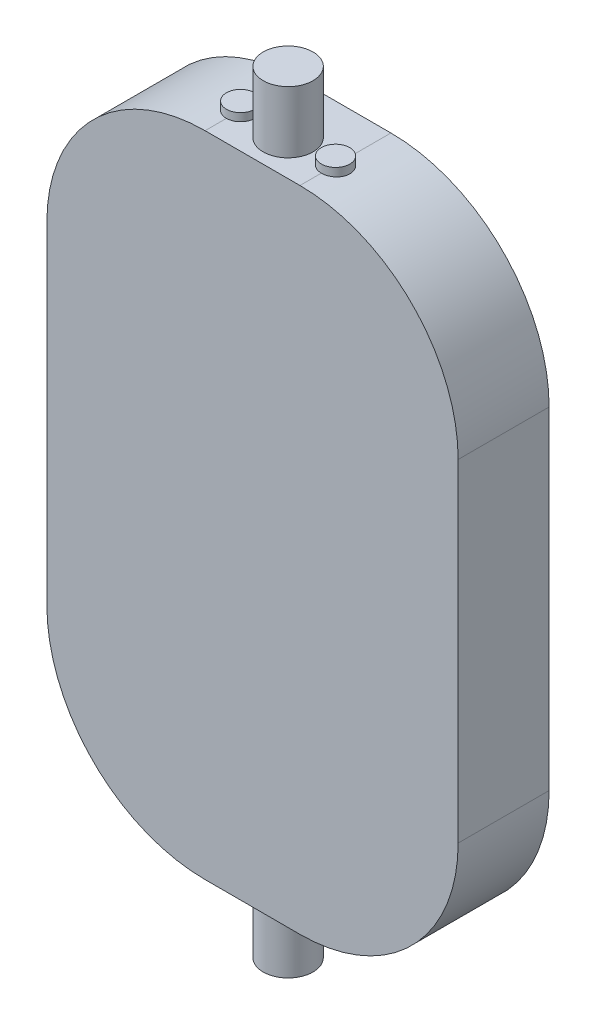
ISO-10303-21;
HEADER;
FILE_DESCRIPTION(('STEP AP214'),'2;1');
FILE_NAME('part.step','',(''),(''),'','','');
FILE_SCHEMA(('AUTOMOTIVE_DESIGN { 1 0 10303 214 1 1 1 1 }'));
ENDSEC;
DATA;
#1=APPLICATION_CONTEXT('core data for automotive mechanical design processes');
#2=APPLICATION_PROTOCOL_DEFINITION('international standard','automotive_design',2000,#1);
#3=PRODUCT_CONTEXT('',#1,'mechanical');
#4=PRODUCT('Part','Part','',(#3));
#5=PRODUCT_RELATED_PRODUCT_CATEGORY('part','',(#4));
#6=PRODUCT_DEFINITION_FORMATION('','',#4);
#7=PRODUCT_DEFINITION_CONTEXT('part definition',#1,'design');
#8=PRODUCT_DEFINITION('design','',#6,#7);
#9=PRODUCT_DEFINITION_SHAPE('','',#8);
#10=(LENGTH_UNIT() NAMED_UNIT(*) SI_UNIT(.MILLI.,.METRE.));
#11=(NAMED_UNIT(*) PLANE_ANGLE_UNIT() SI_UNIT($,.RADIAN.));
#12=(NAMED_UNIT(*) SI_UNIT($,.STERADIAN.) SOLID_ANGLE_UNIT());
#13=UNCERTAINTY_MEASURE_WITH_UNIT(LENGTH_MEASURE(1.E-05),#10,'distance_accuracy_value','');
#14=(GEOMETRIC_REPRESENTATION_CONTEXT(3) GLOBAL_UNCERTAINTY_ASSIGNED_CONTEXT((#13)) GLOBAL_UNIT_ASSIGNED_CONTEXT((#10,
#11,#12)) REPRESENTATION_CONTEXT('',''));
#15=CARTESIAN_POINT('',(0.,0.,0.));
#16=DIRECTION('',(0.,0.,1.));
#17=DIRECTION('',(1.,0.,0.));
#18=AXIS2_PLACEMENT_3D('',#15,#16,#17);
#19=CARTESIAN_POINT('',(5.99999999999997,-21.,11.5));
#20=DIRECTION('',(0.,0.,-1.));
#21=DIRECTION('',(-1.,0.,0.));
#22=AXIS2_PLACEMENT_3D('',#19,#20,#21);
#23=CYLINDRICAL_SURFACE('',#22,20.);
#24=CARTESIAN_POINT('',(5.99999999999999,-41.,5.2));
#25=CARTESIAN_POINT('',(6.05053264670488,-41.0000010702056,5.20000021519562));
#26=CARTESIAN_POINT('',(6.10104098540096,-40.9998082409723,5.20212929468351));
#27=CARTESIAN_POINT('',(6.20169426691106,-40.9990461347195,5.21062226581715));
#28=CARTESIAN_POINT('',(6.25183923230774,-40.9984768813001,5.21698589197571));
#29=CARTESIAN_POINT('',(6.40109112312599,-40.9962241188083,5.24236480383873));
#30=CARTESIAN_POINT('',(6.499195131727,-40.9939955291772,5.26766831019062));
#31=CARTESIAN_POINT('',(6.68973751877992,-40.9883310561541,5.33432651535487));
#32=CARTESIAN_POINT('',(6.78217364739323,-40.9848946969409,5.3756875409719));
#33=CARTESIAN_POINT('',(6.95879318055657,-40.977200275102,5.47327540660538));
#34=CARTESIAN_POINT('',(7.04297770109758,-40.9729423238245,5.52950023254986));
#35=CARTESIAN_POINT('',(7.20093776793326,-40.9640686244097,5.6553899217196));
#36=CARTESIAN_POINT('',(7.27468649274738,-40.9594519999173,5.72508836511051));
#37=CARTESIAN_POINT('',(7.40946530727147,-40.9503880037537,5.87588493339273));
#38=CARTESIAN_POINT('',(7.47049345458673,-40.9459406580154,5.95698479608595));
#39=CARTESIAN_POINT('',(7.57818155666296,-40.9377098860698,6.12844457208369));
#40=CARTESIAN_POINT('',(7.62481714068026,-40.9339275905915,6.21881985033743));
#41=CARTESIAN_POINT('',(7.70223843318381,-40.9274660281103,6.40615243773806));
#42=CARTESIAN_POINT('',(7.73302542357588,-40.9247866719001,6.50310921382544));
#43=CARTESIAN_POINT('',(7.77779892648844,-40.9208418506557,6.70057900148442));
#44=CARTESIAN_POINT('',(7.79183073178024,-40.9195725745304,6.80108166615477));
#45=CARTESIAN_POINT('',(7.80283559654912,-40.9185796668399,7.00302553669953));
#46=CARTESIAN_POINT('',(7.79980860654651,-40.9188560397579,7.10446674529536));
#47=CARTESIAN_POINT('',(7.77681859377172,-40.9209197865548,7.30509149942634));
#48=CARTESIAN_POINT('',(7.75690537821566,-40.9227027166731,7.40428080460715));
#49=CARTESIAN_POINT('',(7.70078567584156,-40.9275717188637,7.59790309802585));
#50=CARTESIAN_POINT('',(7.66457908586072,-40.9306577991869,7.69233605614435));
#51=CARTESIAN_POINT('',(7.57684415523089,-40.9377905697663,7.87392554241418));
#52=CARTESIAN_POINT('',(7.52529325268648,-40.9418386727773,7.96107111197888));
#53=CARTESIAN_POINT('',(7.40835159535946,-40.9504378719519,8.12548775504));
#54=CARTESIAN_POINT('',(7.34296114146228,-40.9549889571792,8.20275904315441));
#55=CARTESIAN_POINT('',(7.19992823344365,-40.9641006317731,8.3455175807064));
#56=CARTESIAN_POINT('',(7.12224445879866,-40.9686612000752,8.41096343349004));
#57=CARTESIAN_POINT('',(6.95694078829779,-40.9772646084449,8.52791198193278));
#58=CARTESIAN_POINT('',(6.8693178591201,-40.9813072896531,8.57941040465589));
#59=CARTESIAN_POINT('',(6.686584226363,-40.9884208643474,8.66699818281534));
#60=CARTESIAN_POINT('',(6.59146813372821,-40.9914910503023,8.70307632598674));
#61=CARTESIAN_POINT('',(6.39656612188761,-40.9963044433189,8.75868455376905));
#62=CARTESIAN_POINT('',(6.296787519764,-40.9980496600799,8.77823970538766));
#63=CARTESIAN_POINT('',(6.16359762932726,-40.9993578315683,8.79285195150572));
#64=CARTESIAN_POINT('',(6.13090711377621,-40.9995985025723,8.7955338185538));
#65=CARTESIAN_POINT('',(6.06548225078416,-40.9999193849882,8.79910541667386));
#66=CARTESIAN_POINT('',(6.03274806771157,-40.9999998636948,8.79999813311675));
#67=CARTESIAN_POINT('',(5.99999999999999,-41.,8.8));
#68=B_SPLINE_CURVE_WITH_KNOTS('',3,(#24,#25,#26,#27,#28,#29,#30,#31,#32,#33,#34,#35,#36,#37,#38,
#39,#40,#41,#42,#43,#44,#45,#46,#47,#48,#49,#50,#51,#52,#53,#54,#55,#56,#57,#58,#59,#60,#61,#62,
#63,#64,#65,#66,#67),.UNSPECIFIED.,.F.,.F.,(4,2,2,2,2,2,2,2,2,2,2,2,2,2,2,2,2,2,2,2,2,4),(0.,
0.151504508919029,0.302999520075793,0.605456174712382,0.908032121090338,1.2105670888737,
1.51386601585822,1.81721122182237,2.12106729525657,2.42489878757611,2.72790708690254,
3.03091626511682,3.33303479087839,3.63515522955455,3.93772211170358,4.24028241642742,
4.54388218138447,4.84757485225174,5.15148796748767,5.45493918445417,5.55330764444217,
5.65151183002399),.UNSPECIFIED.);
#69=CARTESIAN_POINT('',(5.99999999999998,-41.,5.2));
#70=VERTEX_POINT('',#69);
#71=CARTESIAN_POINT('',(5.99999999999999,-41.,8.8));
#72=VERTEX_POINT('',#71);
#73=EDGE_CURVE('E11',#70,#72,#68,.T.);
#74=ORIENTED_EDGE('',*,*,#73,.F.);
#75=DIRECTION('',(0.,0.,-1.));
#76=VECTOR('',#75,1.);
#77=CARTESIAN_POINT('',(5.99999999999998,-41.,11.5));
#78=LINE('',#77,#76);
#79=CARTESIAN_POINT('',(5.99999999999998,-41.,0.));
#80=VERTEX_POINT('',#79);
#81=EDGE_CURVE('E139',#70,#80,#78,.T.);
#82=ORIENTED_EDGE('',*,*,#81,.T.);
#83=CARTESIAN_POINT('',(5.99999999999997,-21.,0.));
#84=DIRECTION('',(0.,0.,1.));
#85=DIRECTION('',(1.,0.,0.));
#86=AXIS2_PLACEMENT_3D('',#83,#84,#85);
#87=CIRCLE('',#86,20.);
#88=CARTESIAN_POINT('',(26.,-21.,0.));
#89=VERTEX_POINT('',#88);
#90=EDGE_CURVE('E312',#80,#89,#87,.T.);
#91=ORIENTED_EDGE('',*,*,#90,.T.);
#92=DIRECTION('',(0.,0.,-1.));
#93=VECTOR('',#92,1.);
#94=CARTESIAN_POINT('',(26.,-21.,11.5));
#95=LINE('',#94,#93);
#96=CARTESIAN_POINT('',(26.,-21.,11.5));
#97=VERTEX_POINT('',#96);
#98=EDGE_CURVE('E338',#97,#89,#95,.T.);
#99=ORIENTED_EDGE('',*,*,#98,.F.);
#100=CARTESIAN_POINT('',(5.99999999999997,-21.,11.5));
#101=DIRECTION('',(0.,0.,1.));
#102=DIRECTION('',(1.,0.,0.));
#103=AXIS2_PLACEMENT_3D('',#100,#101,#102);
#104=CIRCLE('',#103,20.);
#105=CARTESIAN_POINT('',(5.99999999999998,-41.,11.5));
#106=VERTEX_POINT('',#105);
#107=EDGE_CURVE('E135',#106,#97,#104,.T.);
#108=ORIENTED_EDGE('',*,*,#107,.F.);
#109=EDGE_CURVE('E132',#106,#72,#78,.T.);
#110=ORIENTED_EDGE('',*,*,#109,.T.);
#111=EDGE_LOOP('',(#74,#82,#91,#99,#108,#110));
#112=FACE_BOUND('',#111,.T.);
#113=ADVANCED_FACE('F39',(#112),#23,.T.);
#114=CARTESIAN_POINT('',(-6.,-21.,11.5));
#115=DIRECTION('',(0.,0.,-1.));
#116=DIRECTION('',(-1.,0.,0.));
#117=AXIS2_PLACEMENT_3D('',#114,#115,#116);
#118=CYLINDRICAL_SURFACE('',#117,20.);
#119=CARTESIAN_POINT('',(-6.,-41.,8.8));
#120=CARTESIAN_POINT('',(-6.05053264670489,-41.0000010702056,8.79999978480438));
#121=CARTESIAN_POINT('',(-6.10104098540097,-40.9998082409723,8.79787070531649));
#122=CARTESIAN_POINT('',(-6.20169426691107,-40.9990461347195,8.78937773418285));
#123=CARTESIAN_POINT('',(-6.25183923230775,-40.9984768813001,8.78301410802429));
#124=CARTESIAN_POINT('',(-6.401091123126,-40.9962241188083,8.75763519616126));
#125=CARTESIAN_POINT('',(-6.499195131727,-40.9939955291772,8.73233168980938));
#126=CARTESIAN_POINT('',(-6.68973751877993,-40.9883310561541,8.66567348464513));
#127=CARTESIAN_POINT('',(-6.78217364739324,-40.9848946969409,8.62431245902809));
#128=CARTESIAN_POINT('',(-6.95879318055658,-40.977200275102,8.52672459339461));
#129=CARTESIAN_POINT('',(-7.04297770109759,-40.9729423238245,8.47049976745013));
#130=CARTESIAN_POINT('',(-7.20093776793327,-40.9640686244097,8.34461007828039));
#131=CARTESIAN_POINT('',(-7.27468649274738,-40.9594519999173,8.27491163488949));
#132=CARTESIAN_POINT('',(-7.40946530727147,-40.9503880037537,8.12411506660726));
#133=CARTESIAN_POINT('',(-7.47049345458673,-40.9459406580154,8.04301520391404));
#134=CARTESIAN_POINT('',(-7.57818155666296,-40.9377098860698,7.87155542791631));
#135=CARTESIAN_POINT('',(-7.62481714068027,-40.9339275905915,7.78118014966256));
#136=CARTESIAN_POINT('',(-7.70223843318382,-40.9274660281103,7.59384756226193));
#137=CARTESIAN_POINT('',(-7.73302542357588,-40.9247866719001,7.49689078617455));
#138=CARTESIAN_POINT('',(-7.77779892648845,-40.9208418506557,7.29942099851557));
#139=CARTESIAN_POINT('',(-7.79183073178024,-40.9195725745304,7.19891833384522));
#140=CARTESIAN_POINT('',(-7.80283559654912,-40.9185796668399,6.99697446330046));
#141=CARTESIAN_POINT('',(-7.79980860654651,-40.9188560397579,6.89553325470463));
#142=CARTESIAN_POINT('',(-7.77681859377172,-40.9209197865548,6.69490850057364));
#143=CARTESIAN_POINT('',(-7.75690537821566,-40.9227027166731,6.59571919539284));
#144=CARTESIAN_POINT('',(-7.70078567584156,-40.9275717188637,6.40209690197414));
#145=CARTESIAN_POINT('',(-7.66457908586072,-40.9306577991869,6.30766394385564));
#146=CARTESIAN_POINT('',(-7.57684415523088,-40.9377905697663,6.12607445758581));
#147=CARTESIAN_POINT('',(-7.52529325268647,-40.9418386727773,6.0389288880211));
#148=CARTESIAN_POINT('',(-7.40835159535946,-40.9504378719519,5.87451224495999));
#149=CARTESIAN_POINT('',(-7.34296114146228,-40.9549889571792,5.79724095684558));
#150=CARTESIAN_POINT('',(-7.19992823344364,-40.9641006317731,5.65448241929359));
#151=CARTESIAN_POINT('',(-7.12224445879865,-40.9686612000752,5.58903656650995));
#152=CARTESIAN_POINT('',(-6.95694078829778,-40.9772646084449,5.47208801806721));
#153=CARTESIAN_POINT('',(-6.86931785912009,-40.9813072896531,5.4205895953441));
#154=CARTESIAN_POINT('',(-6.68658422636299,-40.9884208643474,5.33300181718465));
#155=CARTESIAN_POINT('',(-6.5914681337282,-40.9914910503023,5.29692367401325));
#156=CARTESIAN_POINT('',(-6.3965661218876,-40.9963044433189,5.24131544623094));
#157=CARTESIAN_POINT('',(-6.29678751976399,-40.9980496600799,5.22176029461234));
#158=CARTESIAN_POINT('',(-6.16359762932726,-40.9993578315683,5.20714804849428));
#159=CARTESIAN_POINT('',(-6.1309071137762,-40.9995985025724,5.2044661814462));
#160=CARTESIAN_POINT('',(-6.06548225078416,-40.9999193849882,5.20089458332614));
#161=CARTESIAN_POINT('',(-6.03274806771157,-40.9999998636948,5.20000186688325));
#162=CARTESIAN_POINT('',(-6.,-41.,5.2));
#163=B_SPLINE_CURVE_WITH_KNOTS('',3,(#119,#120,#121,#122,#123,#124,#125,#126,#127,#128,#129,
#130,#131,#132,#133,#134,#135,#136,#137,#138,#139,#140,#141,#142,#143,#144,#145,#146,#147,#148,
#149,#150,#151,#152,#153,#154,#155,#156,#157,#158,#159,#160,#161,#162),.UNSPECIFIED.,.F.,.F.,(4,
2,2,2,2,2,2,2,2,2,2,2,2,2,2,2,2,2,2,2,2,4),(0.,0.151504508919028,0.302999520075792,
0.605456174712382,0.908032121090338,1.2105670888737,1.51386601585822,1.81721122182237,
2.12106729525657,2.42489878757611,2.72790708690254,3.03091626511682,3.33303479087839,
3.63515522955455,3.93772211170358,4.24028241642742,4.54388218138447,4.84757485225174,
5.15148796748767,5.45493918445417,5.55330764444216,5.65151183002397),.UNSPECIFIED.);
#164=CARTESIAN_POINT('',(-6.,-41.,8.8));
#165=VERTEX_POINT('',#164);
#166=CARTESIAN_POINT('',(-6.,-41.,5.2));
#167=VERTEX_POINT('',#166);
#168=EDGE_CURVE('E183',#165,#167,#163,.T.);
#169=ORIENTED_EDGE('',*,*,#168,.F.);
#170=DIRECTION('',(0.,0.,-1.));
#171=VECTOR('',#170,1.);
#172=CARTESIAN_POINT('',(-6.,-41.,11.5));
#173=LINE('',#172,#171);
#174=CARTESIAN_POINT('',(-6.,-41.,11.5));
#175=VERTEX_POINT('',#174);
#176=EDGE_CURVE('E342',#175,#165,#173,.T.);
#177=ORIENTED_EDGE('',*,*,#176,.F.);
#178=CARTESIAN_POINT('',(-6.,-21.,11.5));
#179=DIRECTION('',(0.,0.,1.));
#180=DIRECTION('',(-1.,0.,0.));
#181=AXIS2_PLACEMENT_3D('',#178,#179,#180);
#182=CIRCLE('',#181,20.);
#183=CARTESIAN_POINT('',(-26.,-21.,11.5));
#184=VERTEX_POINT('',#183);
#185=EDGE_CURVE('E281',#184,#175,#182,.T.);
#186=ORIENTED_EDGE('',*,*,#185,.F.);
#187=DIRECTION('',(0.,0.,-1.));
#188=VECTOR('',#187,1.);
#189=CARTESIAN_POINT('',(-26.,-21.,11.5));
#190=LINE('',#189,#188);
#191=CARTESIAN_POINT('',(-26.,-21.,0.));
#192=VERTEX_POINT('',#191);
#193=EDGE_CURVE('E345',#184,#192,#190,.T.);
#194=ORIENTED_EDGE('',*,*,#193,.T.);
#195=CARTESIAN_POINT('',(-6.,-21.,0.));
#196=DIRECTION('',(0.,0.,1.));
#197=DIRECTION('',(-1.,0.,0.));
#198=AXIS2_PLACEMENT_3D('',#195,#196,#197);
#199=CIRCLE('',#198,20.);
#200=CARTESIAN_POINT('',(-6.,-41.,0.));
#201=VERTEX_POINT('',#200);
#202=EDGE_CURVE('E305',#192,#201,#199,.T.);
#203=ORIENTED_EDGE('',*,*,#202,.T.);
#204=EDGE_CURVE('E138',#167,#201,#173,.T.);
#205=ORIENTED_EDGE('',*,*,#204,.F.);
#206=EDGE_LOOP('',(#169,#177,#186,#194,#203,#205));
#207=FACE_BOUND('',#206,.T.);
#208=ADVANCED_FACE('F168',(#207),#118,.T.);
#209=CARTESIAN_POINT('',(-5.99999999999999,21.,11.5));
#210=DIRECTION('',(0.,0.,-1.));
#211=DIRECTION('',(-1.,0.,0.));
#212=AXIS2_PLACEMENT_3D('',#209,#210,#211);
#213=CYLINDRICAL_SURFACE('',#212,20.);
#214=DIRECTION('',(0.,0.,-1.));
#215=VECTOR('',#214,1.);
#216=CARTESIAN_POINT('',(-5.99999999999999,41.,11.5));
#217=LINE('',#216,#215);
#218=CARTESIAN_POINT('',(-5.99999999999999,41.,11.5));
#219=VERTEX_POINT('',#218);
#220=CARTESIAN_POINT('',(-5.99999999999999,41.,8.8));
#221=VERTEX_POINT('',#220);
#222=EDGE_CURVE('E325',#219,#221,#217,.T.);
#223=ORIENTED_EDGE('',*,*,#222,.T.);
#224=CARTESIAN_POINT('',(-6.,41.,8.8));
#225=CARTESIAN_POINT('',(-6.05053264670489,41.0000010702056,8.79999978480438));
#226=CARTESIAN_POINT('',(-6.10104098540097,40.9998082409723,8.79787070531649));
#227=CARTESIAN_POINT('',(-6.20169426691106,40.9990461347195,8.78937773418285));
#228=CARTESIAN_POINT('',(-6.25183923230774,40.9984768813001,8.78301410802429));
#229=CARTESIAN_POINT('',(-6.401091123126,40.9962241188083,8.75763519616126));
#230=CARTESIAN_POINT('',(-6.499195131727,40.9939955291772,8.73233168980938));
#231=CARTESIAN_POINT('',(-6.68973751877992,40.9883310561541,8.66567348464513));
#232=CARTESIAN_POINT('',(-6.78217364739324,40.9848946969409,8.62431245902809));
#233=CARTESIAN_POINT('',(-6.95879318055658,40.977200275102,8.52672459339461));
#234=CARTESIAN_POINT('',(-7.04297770109759,40.9729423238246,8.47049976745013));
#235=CARTESIAN_POINT('',(-7.20093776793326,40.9640686244097,8.34461007828039));
#236=CARTESIAN_POINT('',(-7.27468649274738,40.9594519999173,8.27491163488949));
#237=CARTESIAN_POINT('',(-7.40946530727147,40.9503880037537,8.12411506660726));
#238=CARTESIAN_POINT('',(-7.47049345458673,40.9459406580154,8.04301520391404));
#239=CARTESIAN_POINT('',(-7.57818155666296,40.9377098860698,7.87155542791631));
#240=CARTESIAN_POINT('',(-7.62481714068027,40.9339275905915,7.78118014966257));
#241=CARTESIAN_POINT('',(-7.70223843318382,40.9274660281103,7.59384756226193));
#242=CARTESIAN_POINT('',(-7.73302542357588,40.9247866719001,7.49689078617455));
#243=CARTESIAN_POINT('',(-7.77779892648845,40.9208418506557,7.29942099851557));
#244=CARTESIAN_POINT('',(-7.79183073178024,40.9195725745304,7.19891833384522));
#245=CARTESIAN_POINT('',(-7.80283559654912,40.9185796668399,6.99697446330046));
#246=CARTESIAN_POINT('',(-7.79980860654651,40.9188560397579,6.89553325470463));
#247=CARTESIAN_POINT('',(-7.77681859377172,40.9209197865548,6.69490850057365));
#248=CARTESIAN_POINT('',(-7.75690537821566,40.9227027166731,6.59571919539284));
#249=CARTESIAN_POINT('',(-7.70078567584156,40.9275717188637,6.40209690197414));
#250=CARTESIAN_POINT('',(-7.66457908586072,40.9306577991869,6.30766394385564));
#251=CARTESIAN_POINT('',(-7.57684415523088,40.9377905697663,6.12607445758581));
#252=CARTESIAN_POINT('',(-7.52529325268647,40.9418386727773,6.03892888802111));
#253=CARTESIAN_POINT('',(-7.40835159535946,40.9504378719519,5.87451224495999));
#254=CARTESIAN_POINT('',(-7.34296114146228,40.9549889571792,5.79724095684558));
#255=CARTESIAN_POINT('',(-7.19992823344364,40.9641006317731,5.65448241929359));
#256=CARTESIAN_POINT('',(-7.12224445879865,40.9686612000752,5.58903656650995));
#257=CARTESIAN_POINT('',(-6.95694078829778,40.9772646084449,5.47208801806721));
#258=CARTESIAN_POINT('',(-6.86931785912009,40.9813072896531,5.4205895953441));
#259=CARTESIAN_POINT('',(-6.68658422636299,40.9884208643474,5.33300181718465));
#260=CARTESIAN_POINT('',(-6.59146813372821,40.9914910503023,5.29692367401325));
#261=CARTESIAN_POINT('',(-6.3965661218876,40.9963044433189,5.24131544623094));
#262=CARTESIAN_POINT('',(-6.296787519764,40.9980496600799,5.22176029461234));
#263=CARTESIAN_POINT('',(-6.16359762932726,40.9993578315683,5.20714804849428));
#264=CARTESIAN_POINT('',(-6.1309071137762,40.9995985025724,5.2044661814462));
#265=CARTESIAN_POINT('',(-6.06548225078416,40.9999193849882,5.20089458332614));
#266=CARTESIAN_POINT('',(-6.03274806771157,40.9999998636948,5.20000186688325));
#267=CARTESIAN_POINT('',(-6.,41.,5.2));
#268=B_SPLINE_CURVE_WITH_KNOTS('',3,(#224,#225,#226,#227,#228,#229,#230,#231,#232,#233,#234,
#235,#236,#237,#238,#239,#240,#241,#242,#243,#244,#245,#246,#247,#248,#249,#250,#251,#252,#253,
#254,#255,#256,#257,#258,#259,#260,#261,#262,#263,#264,#265,#266,#267),.UNSPECIFIED.,.F.,.F.,(4,
2,2,2,2,2,2,2,2,2,2,2,2,2,2,2,2,2,2,2,2,4),(0.,0.151504508919029,0.302999520075793,
0.605456174712381,0.908032121090337,1.2105670888737,1.51386601585822,1.81721122182237,
2.12106729525657,2.42489878757611,2.72790708690254,3.03091626511682,3.33303479087839,
3.63515522955455,3.93772211170358,4.24028241642742,4.54388218138447,4.84757485225174,
5.15148796748767,5.45493918445417,5.55330764444216,5.65151183002398),.UNSPECIFIED.);
#269=CARTESIAN_POINT('',(-5.99999999999999,41.,5.2));
#270=VERTEX_POINT('',#269);
#271=EDGE_CURVE('E260',#221,#270,#268,.T.);
#272=ORIENTED_EDGE('',*,*,#271,.T.);
#273=CARTESIAN_POINT('',(-5.99999999999999,41.,0.));
#274=VERTEX_POINT('',#273);
#275=EDGE_CURVE('E298',#270,#274,#217,.T.);
#276=ORIENTED_EDGE('',*,*,#275,.T.);
#277=CARTESIAN_POINT('',(-5.99999999999999,21.,0.));
#278=DIRECTION('',(0.,0.,1.));
#279=DIRECTION('',(1.,0.,0.));
#280=AXIS2_PLACEMENT_3D('',#277,#278,#279);
#281=CIRCLE('',#280,20.);
#282=CARTESIAN_POINT('',(-26.,21.,0.));
#283=VERTEX_POINT('',#282);
#284=EDGE_CURVE('E272',#274,#283,#281,.T.);
#285=ORIENTED_EDGE('',*,*,#284,.T.);
#286=DIRECTION('',(0.,0.,-1.));
#287=VECTOR('',#286,1.);
#288=CARTESIAN_POINT('',(-26.,21.,11.5));
#289=LINE('',#288,#287);
#290=CARTESIAN_POINT('',(-26.,21.,11.5));
#291=VERTEX_POINT('',#290);
#292=EDGE_CURVE('E349',#291,#283,#289,.T.);
#293=ORIENTED_EDGE('',*,*,#292,.F.);
#294=CARTESIAN_POINT('',(-5.99999999999999,21.,11.5));
#295=DIRECTION('',(0.,0.,1.));
#296=DIRECTION('',(1.,0.,0.));
#297=AXIS2_PLACEMENT_3D('',#294,#295,#296);
#298=CIRCLE('',#297,20.);
#299=EDGE_CURVE('E273',#219,#291,#298,.T.);
#300=ORIENTED_EDGE('',*,*,#299,.F.);
#301=EDGE_LOOP('',(#223,#272,#276,#285,#293,#300));
#302=FACE_BOUND('',#301,.T.);
#303=ADVANCED_FACE('F41',(#302),#213,.T.);
#304=CARTESIAN_POINT('',(-26.,21.,11.5));
#305=DIRECTION('',(1.,0.,0.));
#306=DIRECTION('',(0.,1.,0.));
#307=AXIS2_PLACEMENT_3D('',#304,#305,#306);
#308=PLANE('',#307);
#309=DIRECTION('',(0.,-1.,0.));
#310=VECTOR('',#309,1.);
#311=CARTESIAN_POINT('',(-26.,21.,0.));
#312=LINE('',#311,#310);
#313=EDGE_CURVE('E302',#283,#192,#312,.T.);
#314=ORIENTED_EDGE('',*,*,#313,.T.);
#315=ORIENTED_EDGE('',*,*,#193,.F.);
#316=DIRECTION('',(0.,-1.,0.));
#317=VECTOR('',#316,1.);
#318=CARTESIAN_POINT('',(-26.,21.,11.5));
#319=LINE('',#318,#317);
#320=EDGE_CURVE('E277',#291,#184,#319,.T.);
#321=ORIENTED_EDGE('',*,*,#320,.F.);
#322=ORIENTED_EDGE('',*,*,#292,.T.);
#323=EDGE_LOOP('',(#314,#315,#321,#322));
#324=FACE_BOUND('',#323,.T.);
#325=ADVANCED_FACE('F180',(#324),#308,.F.);
#326=CARTESIAN_POINT('',(-6.,-41.,11.5));
#327=DIRECTION('',(0.,1.,0.));
#328=DIRECTION('',(-1.,0.,0.));
#329=AXIS2_PLACEMENT_3D('',#326,#327,#328);
#330=PLANE('',#329);
#331=CARTESIAN_POINT('',(6.,-41.,7.));
#332=DIRECTION('',(0.,1.,0.));
#333=DIRECTION('',(-1.,0.,0.));
#334=AXIS2_PLACEMENT_3D('',#331,#332,#333);
#335=CIRCLE('',#334,1.8);
#336=EDGE_CURVE('E142',#72,#70,#335,.F.);
#337=ORIENTED_EDGE('',*,*,#336,.F.);
#338=ORIENTED_EDGE('',*,*,#109,.F.);
#339=DIRECTION('',(1.,0.,0.));
#340=VECTOR('',#339,1.);
#341=CARTESIAN_POINT('',(-6.,-41.,11.5));
#342=LINE('',#341,#340);
#343=EDGE_CURVE('E284',#175,#106,#342,.T.);
#344=ORIENTED_EDGE('',*,*,#343,.F.);
#345=ORIENTED_EDGE('',*,*,#176,.T.);
#346=CARTESIAN_POINT('',(-6.,-41.,7.));
#347=DIRECTION('',(0.,1.,0.));
#348=DIRECTION('',(-1.,0.,0.));
#349=AXIS2_PLACEMENT_3D('',#346,#347,#348);
#350=CIRCLE('',#349,1.8);
#351=EDGE_CURVE('E55',#167,#165,#350,.F.);
#352=ORIENTED_EDGE('',*,*,#351,.F.);
#353=ORIENTED_EDGE('',*,*,#204,.T.);
#354=DIRECTION('',(1.,0.,0.));
#355=VECTOR('',#354,1.);
#356=CARTESIAN_POINT('',(-6.,-41.,0.));
#357=LINE('',#356,#355);
#358=EDGE_CURVE('E309',#201,#80,#357,.T.);
#359=ORIENTED_EDGE('',*,*,#358,.T.);
#360=ORIENTED_EDGE('',*,*,#81,.F.);
#361=EDGE_LOOP('',(#337,#338,#344,#345,#352,#353,#359,#360));
#362=FACE_BOUND('',#361,.T.);
#363=CARTESIAN_POINT('',(0.,-41.,7.));
#364=DIRECTION('',(0.,1.,0.));
#365=DIRECTION('',(0.,0.,1.));
#366=AXIS2_PLACEMENT_3D('',#363,#364,#365);
#367=CIRCLE('',#366,3.15);
#368=CARTESIAN_POINT('',(0.,-41.,10.15));
#369=VERTEX_POINT('',#368);
#370=EDGE_CURVE('E193',#369,#369,#367,.T.);
#371=ORIENTED_EDGE('',*,*,#370,.T.);
#372=EDGE_LOOP('',(#371));
#373=FACE_BOUND('',#372,.T.);
#374=ADVANCED_FACE('F143',(#362,#373),#330,.F.);
#375=CARTESIAN_POINT('',(26.,21.,11.5));
#376=DIRECTION('',(-1.,0.,0.));
#377=DIRECTION('',(0.,-1.,0.));
#378=AXIS2_PLACEMENT_3D('',#375,#376,#377);
#379=PLANE('',#378);
#380=DIRECTION('',(0.,1.,0.));
#381=VECTOR('',#380,1.);
#382=CARTESIAN_POINT('',(26.,21.,0.));
#383=LINE('',#382,#381);
#384=CARTESIAN_POINT('',(26.,21.,0.));
#385=VERTEX_POINT('',#384);
#386=EDGE_CURVE('E315',#89,#385,#383,.T.);
#387=ORIENTED_EDGE('',*,*,#386,.T.);
#388=DIRECTION('',(0.,0.,-1.));
#389=VECTOR('',#388,1.);
#390=CARTESIAN_POINT('',(26.,21.,11.5));
#391=LINE('',#390,#389);
#392=CARTESIAN_POINT('',(26.,21.,11.5));
#393=VERTEX_POINT('',#392);
#394=EDGE_CURVE('E334',#393,#385,#391,.T.);
#395=ORIENTED_EDGE('',*,*,#394,.F.);
#396=DIRECTION('',(0.,1.,0.));
#397=VECTOR('',#396,1.);
#398=CARTESIAN_POINT('',(26.,21.,11.5));
#399=LINE('',#398,#397);
#400=EDGE_CURVE('E289',#97,#393,#399,.T.);
#401=ORIENTED_EDGE('',*,*,#400,.F.);
#402=ORIENTED_EDGE('',*,*,#98,.T.);
#403=EDGE_LOOP('',(#387,#395,#401,#402));
#404=FACE_BOUND('',#403,.T.);
#405=ADVANCED_FACE('F177',(#404),#379,.F.);
#406=CARTESIAN_POINT('',(5.99999999999999,21.,11.5));
#407=DIRECTION('',(0.,0.,-1.));
#408=DIRECTION('',(-1.,0.,0.));
#409=AXIS2_PLACEMENT_3D('',#406,#407,#408);
#410=CYLINDRICAL_SURFACE('',#409,20.);
#411=DIRECTION('',(0.,0.,-1.));
#412=VECTOR('',#411,1.);
#413=CARTESIAN_POINT('',(5.99999999999999,41.,11.5));
#414=LINE('',#413,#412);
#415=CARTESIAN_POINT('',(5.99999999999999,41.,5.2));
#416=VERTEX_POINT('',#415);
#417=CARTESIAN_POINT('',(5.99999999999999,41.,0.));
#418=VERTEX_POINT('',#417);
#419=EDGE_CURVE('E329',#416,#418,#414,.T.);
#420=ORIENTED_EDGE('',*,*,#419,.F.);
#421=CARTESIAN_POINT('',(5.99999999999999,41.,5.2));
#422=CARTESIAN_POINT('',(6.05053264670489,41.0000010702056,5.20000021519562));
#423=CARTESIAN_POINT('',(6.10104098540096,40.9998082409723,5.20212929468351));
#424=CARTESIAN_POINT('',(6.20169426691106,40.9990461347195,5.21062226581715));
#425=CARTESIAN_POINT('',(6.25183923230774,40.9984768813001,5.21698589197571));
#426=CARTESIAN_POINT('',(6.401091123126,40.9962241188083,5.24236480383874));
#427=CARTESIAN_POINT('',(6.499195131727,40.9939955291772,5.26766831019062));
#428=CARTESIAN_POINT('',(6.68973751877992,40.9883310561541,5.33432651535487));
#429=CARTESIAN_POINT('',(6.78217364739324,40.9848946969409,5.3756875409719));
#430=CARTESIAN_POINT('',(6.95879318055658,40.977200275102,5.47327540660538));
#431=CARTESIAN_POINT('',(7.04297770109759,40.9729423238246,5.52950023254986));
#432=CARTESIAN_POINT('',(7.20093776793326,40.9640686244097,5.6553899217196));
#433=CARTESIAN_POINT('',(7.27468649274738,40.9594519999173,5.72508836511051));
#434=CARTESIAN_POINT('',(7.40946530727147,40.9503880037537,5.87588493339273));
#435=CARTESIAN_POINT('',(7.47049345458673,40.9459406580154,5.95698479608595));
#436=CARTESIAN_POINT('',(7.57818155666296,40.9377098860698,6.12844457208369));
#437=CARTESIAN_POINT('',(7.62481714068027,40.9339275905915,6.21881985033743));
#438=CARTESIAN_POINT('',(7.70223843318381,40.9274660281103,6.40615243773806));
#439=CARTESIAN_POINT('',(7.73302542357588,40.9247866719001,6.50310921382545));
#440=CARTESIAN_POINT('',(7.77779892648844,40.9208418506557,6.70057900148442));
#441=CARTESIAN_POINT('',(7.79183073178024,40.9195725745304,6.80108166615478));
#442=CARTESIAN_POINT('',(7.80283559654912,40.9185796668399,7.00302553669953));
#443=CARTESIAN_POINT('',(7.79980860654651,40.9188560397579,7.10446674529536));
#444=CARTESIAN_POINT('',(7.77681859377172,40.9209197865548,7.30509149942635));
#445=CARTESIAN_POINT('',(7.75690537821566,40.9227027166731,7.40428080460715));
#446=CARTESIAN_POINT('',(7.70078567584156,40.9275717188637,7.59790309802586));
#447=CARTESIAN_POINT('',(7.66457908586072,40.9306577991869,7.69233605614435));
#448=CARTESIAN_POINT('',(7.57684415523089,40.9377905697663,7.87392554241419));
#449=CARTESIAN_POINT('',(7.52529325268647,40.9418386727773,7.96107111197889));
#450=CARTESIAN_POINT('',(7.40835159535946,40.9504378719519,8.12548775504001));
#451=CARTESIAN_POINT('',(7.34296114146228,40.9549889571792,8.20275904315442));
#452=CARTESIAN_POINT('',(7.19992823344364,40.9641006317731,8.3455175807064));
#453=CARTESIAN_POINT('',(7.12224445879865,40.9686612000752,8.41096343349004));
#454=CARTESIAN_POINT('',(6.95694078829779,40.9772646084449,8.52791198193279));
#455=CARTESIAN_POINT('',(6.8693178591201,40.9813072896531,8.57941040465589));
#456=CARTESIAN_POINT('',(6.686584226363,40.9884208643474,8.66699818281534));
#457=CARTESIAN_POINT('',(6.59146813372821,40.9914910503023,8.70307632598674));
#458=CARTESIAN_POINT('',(6.39656612188761,40.9963044433189,8.75868455376905));
#459=CARTESIAN_POINT('',(6.296787519764,40.9980496600799,8.77823970538766));
#460=CARTESIAN_POINT('',(6.16359762932726,40.9993578315683,8.79285195150572));
#461=CARTESIAN_POINT('',(6.13090711377621,40.9995985025724,8.7955338185538));
#462=CARTESIAN_POINT('',(6.06548225078416,40.9999193849882,8.79910541667386));
#463=CARTESIAN_POINT('',(6.03274806771157,40.9999998636948,8.79999813311675));
#464=CARTESIAN_POINT('',(5.99999999999999,41.,8.8));
#465=B_SPLINE_CURVE_WITH_KNOTS('',3,(#421,#422,#423,#424,#425,#426,#427,#428,#429,#430,#431,
#432,#433,#434,#435,#436,#437,#438,#439,#440,#441,#442,#443,#444,#445,#446,#447,#448,#449,#450,
#451,#452,#453,#454,#455,#456,#457,#458,#459,#460,#461,#462,#463,#464),.UNSPECIFIED.,.F.,.F.,(4,
2,2,2,2,2,2,2,2,2,2,2,2,2,2,2,2,2,2,2,2,4),(0.,0.151504508919029,0.302999520075792,
0.605456174712381,0.908032121090338,1.2105670888737,1.51386601585822,1.81721122182237,
2.12106729525657,2.42489878757611,2.72790708690254,3.03091626511682,3.33303479087839,
3.63515522955455,3.93772211170358,4.24028241642742,4.54388218138447,4.84757485225173,
5.15148796748767,5.45493918445416,5.55330764444216,5.65151183002398),.UNSPECIFIED.);
#466=CARTESIAN_POINT('',(5.99999999999999,41.,8.8));
#467=VERTEX_POINT('',#466);
#468=EDGE_CURVE('E220',#416,#467,#465,.T.);
#469=ORIENTED_EDGE('',*,*,#468,.T.);
#470=CARTESIAN_POINT('',(5.99999999999999,41.,11.5));
#471=VERTEX_POINT('',#470);
#472=EDGE_CURVE('E330',#471,#467,#414,.T.);
#473=ORIENTED_EDGE('',*,*,#472,.F.);
#474=CARTESIAN_POINT('',(5.99999999999999,21.,11.5));
#475=DIRECTION('',(0.,0.,1.));
#476=DIRECTION('',(-1.,0.,0.));
#477=AXIS2_PLACEMENT_3D('',#474,#475,#476);
#478=CIRCLE('',#477,20.);
#479=EDGE_CURVE('E292',#393,#471,#478,.T.);
#480=ORIENTED_EDGE('',*,*,#479,.F.);
#481=ORIENTED_EDGE('',*,*,#394,.T.);
#482=CARTESIAN_POINT('',(5.99999999999999,21.,0.));
#483=DIRECTION('',(0.,0.,1.));
#484=DIRECTION('',(-1.,0.,0.));
#485=AXIS2_PLACEMENT_3D('',#482,#483,#484);
#486=CIRCLE('',#485,20.);
#487=EDGE_CURVE('E318',#385,#418,#486,.T.);
#488=ORIENTED_EDGE('',*,*,#487,.T.);
#489=EDGE_LOOP('',(#420,#469,#473,#480,#481,#488));
#490=FACE_BOUND('',#489,.T.);
#491=ADVANCED_FACE('F232',(#490),#410,.T.);
#492=CARTESIAN_POINT('',(-5.99999999999999,41.,11.5));
#493=DIRECTION('',(0.,-1.,0.));
#494=DIRECTION('',(0.,0.,-1.));
#495=AXIS2_PLACEMENT_3D('',#492,#493,#494);
#496=PLANE('',#495);
#497=CARTESIAN_POINT('',(0.,41.,7.));
#498=DIRECTION('',(0.,-1.,0.));
#499=DIRECTION('',(0.,0.,-1.));
#500=AXIS2_PLACEMENT_3D('',#497,#498,#499);
#501=CIRCLE('',#500,3.15);
#502=CARTESIAN_POINT('',(0.,41.,3.85));
#503=VERTEX_POINT('',#502);
#504=EDGE_CURVE('E353',#503,#503,#501,.F.);
#505=ORIENTED_EDGE('',*,*,#504,.F.);
#506=EDGE_LOOP('',(#505));
#507=FACE_BOUND('',#506,.T.);
#508=ORIENTED_EDGE('',*,*,#472,.T.);
#509=CARTESIAN_POINT('',(6.,41.,7.));
#510=DIRECTION('',(0.,-1.,0.));
#511=DIRECTION('',(0.,0.,-1.));
#512=AXIS2_PLACEMENT_3D('',#509,#510,#511);
#513=CIRCLE('',#512,1.8);
#514=EDGE_CURVE('E361',#467,#416,#513,.T.);
#515=ORIENTED_EDGE('',*,*,#514,.T.);
#516=ORIENTED_EDGE('',*,*,#419,.T.);
#517=DIRECTION('',(-1.,0.,0.));
#518=VECTOR('',#517,1.);
#519=CARTESIAN_POINT('',(-5.99999999999999,41.,0.));
#520=LINE('',#519,#518);
#521=EDGE_CURVE('E278',#418,#274,#520,.T.);
#522=ORIENTED_EDGE('',*,*,#521,.T.);
#523=ORIENTED_EDGE('',*,*,#275,.F.);
#524=CARTESIAN_POINT('',(-6.,41.,7.));
#525=DIRECTION('',(0.,-1.,0.));
#526=DIRECTION('',(0.,0.,-1.));
#527=AXIS2_PLACEMENT_3D('',#524,#525,#526);
#528=CIRCLE('',#527,1.8);
#529=EDGE_CURVE('E357',#270,#221,#528,.T.);
#530=ORIENTED_EDGE('',*,*,#529,.T.);
#531=ORIENTED_EDGE('',*,*,#222,.F.);
#532=DIRECTION('',(-1.,0.,0.));
#533=VECTOR('',#532,1.);
#534=CARTESIAN_POINT('',(-5.99999999999999,41.,11.5));
#535=LINE('',#534,#533);
#536=EDGE_CURVE('E295',#471,#219,#535,.T.);
#537=ORIENTED_EDGE('',*,*,#536,.F.);
#538=EDGE_LOOP('',(#508,#515,#516,#522,#523,#530,#531,#537));
#539=FACE_BOUND('',#538,.T.);
#540=ADVANCED_FACE('F236',(#507,#539),#496,.F.);
#541=CARTESIAN_POINT('',(-5.99999999999999,21.,11.5));
#542=DIRECTION('',(0.,0.,1.));
#543=DIRECTION('',(1.,0.,0.));
#544=AXIS2_PLACEMENT_3D('',#541,#542,#543);
#545=PLANE('',#544);
#546=ORIENTED_EDGE('',*,*,#299,.T.);
#547=ORIENTED_EDGE('',*,*,#320,.T.);
#548=ORIENTED_EDGE('',*,*,#185,.T.);
#549=ORIENTED_EDGE('',*,*,#343,.T.);
#550=ORIENTED_EDGE('',*,*,#107,.T.);
#551=ORIENTED_EDGE('',*,*,#400,.T.);
#552=ORIENTED_EDGE('',*,*,#479,.T.);
#553=ORIENTED_EDGE('',*,*,#536,.T.);
#554=EDGE_LOOP('',(#546,#547,#548,#549,#550,#551,#552,#553));
#555=FACE_BOUND('',#554,.T.);
#556=ADVANCED_FACE('F240',(#555),#545,.T.);
#557=CARTESIAN_POINT('',(-5.99999999999999,21.,0.));
#558=DIRECTION('',(0.,0.,1.));
#559=DIRECTION('',(1.,0.,0.));
#560=AXIS2_PLACEMENT_3D('',#557,#558,#559);
#561=PLANE('',#560);
#562=ORIENTED_EDGE('',*,*,#284,.F.);
#563=ORIENTED_EDGE('',*,*,#521,.F.);
#564=ORIENTED_EDGE('',*,*,#487,.F.);
#565=ORIENTED_EDGE('',*,*,#386,.F.);
#566=ORIENTED_EDGE('',*,*,#90,.F.);
#567=ORIENTED_EDGE('',*,*,#358,.F.);
#568=ORIENTED_EDGE('',*,*,#202,.F.);
#569=ORIENTED_EDGE('',*,*,#313,.F.);
#570=EDGE_LOOP('',(#562,#563,#564,#565,#566,#567,#568,#569));
#571=FACE_BOUND('',#570,.T.);
#572=ADVANCED_FACE('F242',(#571),#561,.F.);
#573=CARTESIAN_POINT('',(0.,48.8,7.));
#574=DIRECTION('',(0.,-1.,0.));
#575=DIRECTION('',(0.,0.,-1.));
#576=AXIS2_PLACEMENT_3D('',#573,#574,#575);
#577=CYLINDRICAL_SURFACE('',#576,3.15);
#578=CARTESIAN_POINT('',(0.,48.8,7.));
#579=DIRECTION('',(0.,1.,0.));
#580=DIRECTION('',(0.,0.,1.));
#581=AXIS2_PLACEMENT_3D('',#578,#579,#580);
#582=CIRCLE('',#581,3.15);
#583=CARTESIAN_POINT('',(0.,48.8,10.15));
#584=VERTEX_POINT('',#583);
#585=EDGE_CURVE('E268',#584,#584,#582,.T.);
#586=ORIENTED_EDGE('',*,*,#585,.F.);
#587=EDGE_LOOP('',(#586));
#588=FACE_BOUND('',#587,.T.);
#589=ORIENTED_EDGE('',*,*,#504,.T.);
#590=EDGE_LOOP('',(#589));
#591=FACE_BOUND('',#590,.T.);
#592=ADVANCED_FACE('F245',(#588,#591),#577,.T.);
#593=CARTESIAN_POINT('',(0.,48.8,7.));
#594=DIRECTION('',(0.,1.,0.));
#595=DIRECTION('',(0.,0.,1.));
#596=AXIS2_PLACEMENT_3D('',#593,#594,#595);
#597=PLANE('',#596);
#598=ORIENTED_EDGE('',*,*,#585,.T.);
#599=EDGE_LOOP('',(#598));
#600=FACE_BOUND('',#599,.T.);
#601=ADVANCED_FACE('F252',(#600),#597,.T.);
#602=CARTESIAN_POINT('',(-6.,40.,7.));
#603=DIRECTION('',(0.,1.,0.));
#604=DIRECTION('',(0.,0.,1.));
#605=AXIS2_PLACEMENT_3D('',#602,#603,#604);
#606=CYLINDRICAL_SURFACE('',#605,1.8);
#607=CARTESIAN_POINT('',(-6.,42.,7.));
#608=DIRECTION('',(0.,1.,0.));
#609=DIRECTION('',(0.,0.,1.));
#610=AXIS2_PLACEMENT_3D('',#607,#608,#609);
#611=CIRCLE('',#610,1.8);
#612=CARTESIAN_POINT('',(-6.,42.,8.8));
#613=VERTEX_POINT('',#612);
#614=EDGE_CURVE('E229',#613,#613,#611,.T.);
#615=ORIENTED_EDGE('',*,*,#614,.F.);
#616=EDGE_LOOP('',(#615));
#617=FACE_BOUND('',#616,.T.);
#618=ORIENTED_EDGE('',*,*,#271,.F.);
#619=ORIENTED_EDGE('',*,*,#529,.F.);
#620=EDGE_LOOP('',(#618,#619));
#621=FACE_BOUND('',#620,.T.);
#622=ADVANCED_FACE('F255',(#617,#621),#606,.T.);
#623=CARTESIAN_POINT('',(-6.,42.,7.));
#624=DIRECTION('',(0.,1.,0.));
#625=DIRECTION('',(0.,0.,1.));
#626=AXIS2_PLACEMENT_3D('',#623,#624,#625);
#627=PLANE('',#626);
#628=ORIENTED_EDGE('',*,*,#614,.T.);
#629=EDGE_LOOP('',(#628));
#630=FACE_BOUND('',#629,.T.);
#631=ADVANCED_FACE('F216',(#630),#627,.T.);
#632=CARTESIAN_POINT('',(6.,40.,7.));
#633=DIRECTION('',(0.,1.,0.));
#634=DIRECTION('',(0.,0.,1.));
#635=AXIS2_PLACEMENT_3D('',#632,#633,#634);
#636=CYLINDRICAL_SURFACE('',#635,1.8);
#637=CARTESIAN_POINT('',(6.,42.,7.));
#638=DIRECTION('',(0.,1.,0.));
#639=DIRECTION('',(0.,0.,1.));
#640=AXIS2_PLACEMENT_3D('',#637,#638,#639);
#641=CIRCLE('',#640,1.8);
#642=CARTESIAN_POINT('',(6.,42.,8.8));
#643=VERTEX_POINT('',#642);
#644=EDGE_CURVE('E230',#643,#643,#641,.T.);
#645=ORIENTED_EDGE('',*,*,#644,.F.);
#646=EDGE_LOOP('',(#645));
#647=FACE_BOUND('',#646,.T.);
#648=ORIENTED_EDGE('',*,*,#468,.F.);
#649=ORIENTED_EDGE('',*,*,#514,.F.);
#650=EDGE_LOOP('',(#648,#649));
#651=FACE_BOUND('',#650,.T.);
#652=ADVANCED_FACE('F211',(#647,#651),#636,.T.);
#653=CARTESIAN_POINT('',(6.,42.,7.));
#654=DIRECTION('',(0.,1.,0.));
#655=DIRECTION('',(0.,0.,1.));
#656=AXIS2_PLACEMENT_3D('',#653,#654,#655);
#657=PLANE('',#656);
#658=ORIENTED_EDGE('',*,*,#644,.T.);
#659=EDGE_LOOP('',(#658));
#660=FACE_BOUND('',#659,.T.);
#661=ADVANCED_FACE('F207',(#660),#657,.T.);
#662=CARTESIAN_POINT('',(0.,-48.8,7.));
#663=DIRECTION('',(0.,1.,0.));
#664=DIRECTION('',(0.,0.,1.));
#665=AXIS2_PLACEMENT_3D('',#662,#663,#664);
#666=CYLINDRICAL_SURFACE('',#665,3.15);
#667=CARTESIAN_POINT('',(0.,-48.8,7.));
#668=DIRECTION('',(0.,1.,0.));
#669=DIRECTION('',(0.,0.,1.));
#670=AXIS2_PLACEMENT_3D('',#667,#668,#669);
#671=CIRCLE('',#670,3.15);
#672=CARTESIAN_POINT('',(0.,-48.8,10.15));
#673=VERTEX_POINT('',#672);
#674=EDGE_CURVE('E194',#673,#673,#671,.T.);
#675=ORIENTED_EDGE('',*,*,#674,.T.);
#676=EDGE_LOOP('',(#675));
#677=FACE_BOUND('',#676,.T.);
#678=ORIENTED_EDGE('',*,*,#370,.F.);
#679=EDGE_LOOP('',(#678));
#680=FACE_BOUND('',#679,.T.);
#681=ADVANCED_FACE('F203',(#677,#680),#666,.T.);
#682=CARTESIAN_POINT('',(0.,-48.8,7.));
#683=DIRECTION('',(0.,-1.,0.));
#684=DIRECTION('',(0.,0.,1.));
#685=AXIS2_PLACEMENT_3D('',#682,#683,#684);
#686=PLANE('',#685);
#687=ORIENTED_EDGE('',*,*,#674,.F.);
#688=EDGE_LOOP('',(#687));
#689=FACE_BOUND('',#688,.T.);
#690=ADVANCED_FACE('F199',(#689),#686,.T.);
#691=CARTESIAN_POINT('',(-6.,-40.,7.));
#692=DIRECTION('',(0.,-1.,0.));
#693=DIRECTION('',(0.,0.,-1.));
#694=AXIS2_PLACEMENT_3D('',#691,#692,#693);
#695=CYLINDRICAL_SURFACE('',#694,1.8);
#696=CARTESIAN_POINT('',(-6.,-42.,7.));
#697=DIRECTION('',(0.,1.,0.));
#698=DIRECTION('',(0.,0.,1.));
#699=AXIS2_PLACEMENT_3D('',#696,#697,#698);
#700=CIRCLE('',#699,1.8);
#701=CARTESIAN_POINT('',(-6.,-42.,8.8));
#702=VERTEX_POINT('',#701);
#703=EDGE_CURVE('E148',#702,#702,#700,.T.);
#704=ORIENTED_EDGE('',*,*,#703,.T.);
#705=EDGE_LOOP('',(#704));
#706=FACE_BOUND('',#705,.T.);
#707=ORIENTED_EDGE('',*,*,#351,.T.);
#708=ORIENTED_EDGE('',*,*,#168,.T.);
#709=EDGE_LOOP('',(#707,#708));
#710=FACE_BOUND('',#709,.T.);
#711=ADVANCED_FACE('F162',(#706,#710),#695,.T.);
#712=CARTESIAN_POINT('',(-6.,-42.,7.));
#713=DIRECTION('',(0.,-1.,0.));
#714=DIRECTION('',(0.,0.,1.));
#715=AXIS2_PLACEMENT_3D('',#712,#713,#714);
#716=PLANE('',#715);
#717=ORIENTED_EDGE('',*,*,#703,.F.);
#718=EDGE_LOOP('',(#717));
#719=FACE_BOUND('',#718,.T.);
#720=ADVANCED_FACE('F154',(#719),#716,.T.);
#721=CARTESIAN_POINT('',(6.,-40.,7.));
#722=DIRECTION('',(0.,-1.,0.));
#723=DIRECTION('',(0.,0.,-1.));
#724=AXIS2_PLACEMENT_3D('',#721,#722,#723);
#725=CYLINDRICAL_SURFACE('',#724,1.8);
#726=CARTESIAN_POINT('',(6.,-42.,7.));
#727=DIRECTION('',(0.,1.,0.));
#728=DIRECTION('',(0.,0.,1.));
#729=AXIS2_PLACEMENT_3D('',#726,#727,#728);
#730=CIRCLE('',#729,1.8);
#731=CARTESIAN_POINT('',(6.,-42.,8.8));
#732=VERTEX_POINT('',#731);
#733=EDGE_CURVE('E149',#732,#732,#730,.T.);
#734=ORIENTED_EDGE('',*,*,#733,.T.);
#735=EDGE_LOOP('',(#734));
#736=FACE_BOUND('',#735,.T.);
#737=ORIENTED_EDGE('',*,*,#73,.T.);
#738=ORIENTED_EDGE('',*,*,#336,.T.);
#739=EDGE_LOOP('',(#737,#738));
#740=FACE_BOUND('',#739,.T.);
#741=ADVANCED_FACE('F151',(#736,#740),#725,.T.);
#742=CARTESIAN_POINT('',(6.,-42.,7.));
#743=DIRECTION('',(0.,-1.,0.));
#744=DIRECTION('',(0.,0.,1.));
#745=AXIS2_PLACEMENT_3D('',#742,#743,#744);
#746=PLANE('',#745);
#747=ORIENTED_EDGE('',*,*,#733,.F.);
#748=EDGE_LOOP('',(#747));
#749=FACE_BOUND('',#748,.T.);
#750=ADVANCED_FACE('F153',(#749),#746,.T.);
#751=CLOSED_SHELL('',(#113,#208,#303,#325,#374,#405,#491,#540,#556,#572,#592,#601,#622,#631,
#652,#661,#681,#690,#711,#720,#741,#750));
#752=MANIFOLD_SOLID_BREP('B2',#751);
#753=ADVANCED_BREP_SHAPE_REPRESENTATION('',(#18,#752),#14);
#754=SHAPE_DEFINITION_REPRESENTATION(#9,#753);
ENDSEC;
END-ISO-10303-21;
